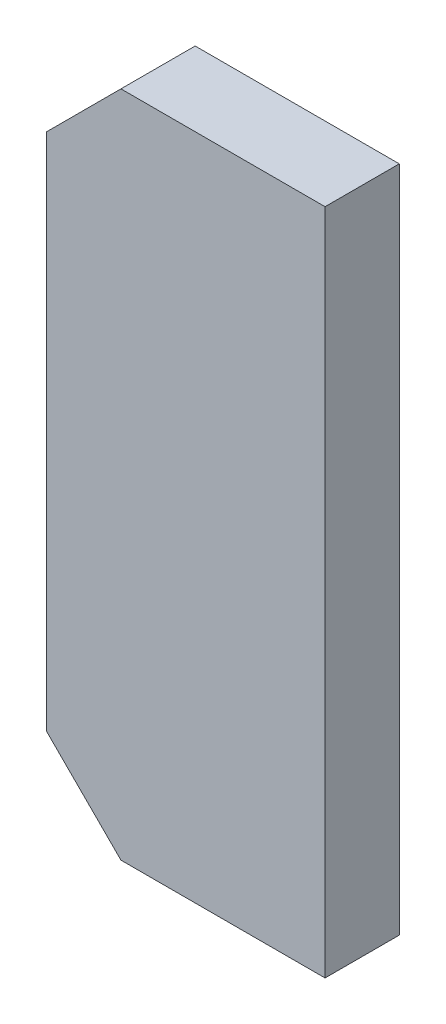
ISO-10303-21;
HEADER;
FILE_DESCRIPTION(('STEP AP214'),'2;1');
FILE_NAME('part.step','',(''),(''),'','','');
FILE_SCHEMA(('AUTOMOTIVE_DESIGN { 1 0 10303 214 1 1 1 1 }'));
ENDSEC;
DATA;
#1=APPLICATION_CONTEXT('core data for automotive mechanical design processes');
#2=APPLICATION_PROTOCOL_DEFINITION('international standard','automotive_design',2000,#1);
#3=PRODUCT_CONTEXT('',#1,'mechanical');
#4=PRODUCT('Part','Part','',(#3));
#5=PRODUCT_RELATED_PRODUCT_CATEGORY('part','',(#4));
#6=PRODUCT_DEFINITION_FORMATION('','',#4);
#7=PRODUCT_DEFINITION_CONTEXT('part definition',#1,'design');
#8=PRODUCT_DEFINITION('design','',#6,#7);
#9=PRODUCT_DEFINITION_SHAPE('','',#8);
#10=(LENGTH_UNIT() NAMED_UNIT(*) SI_UNIT(.MILLI.,.METRE.));
#11=(NAMED_UNIT(*) PLANE_ANGLE_UNIT() SI_UNIT($,.RADIAN.));
#12=(NAMED_UNIT(*) SI_UNIT($,.STERADIAN.) SOLID_ANGLE_UNIT());
#13=UNCERTAINTY_MEASURE_WITH_UNIT(LENGTH_MEASURE(1.E-05),#10,'distance_accuracy_value','');
#14=(GEOMETRIC_REPRESENTATION_CONTEXT(3) GLOBAL_UNCERTAINTY_ASSIGNED_CONTEXT((#13)) GLOBAL_UNIT_ASSIGNED_CONTEXT((#10,
#11,#12)) REPRESENTATION_CONTEXT('',''));
#15=CARTESIAN_POINT('',(0.,0.,0.));
#16=DIRECTION('',(0.,0.,1.));
#17=DIRECTION('',(1.,0.,0.));
#18=AXIS2_PLACEMENT_3D('',#15,#16,#17);
#19=CARTESIAN_POINT('',(-50.8,419.1,12.7));
#20=DIRECTION('',(1.,0.,0.));
#21=DIRECTION('',(0.,0.,-1.));
#22=AXIS2_PLACEMENT_3D('',#19,#20,#21);
#23=PLANE('',#22);
#24=DIRECTION('',(0.,-1.,0.));
#25=VECTOR('',#24,1.);
#26=CARTESIAN_POINT('',(-50.8,419.1,12.7));
#27=LINE('',#26,#25);
#28=CARTESIAN_POINT('',(-50.8,520.7,12.7));
#29=VERTEX_POINT('',#28);
#30=CARTESIAN_POINT('',(-50.8,431.8,12.7));
#31=VERTEX_POINT('',#30);
#32=EDGE_CURVE('E96',#29,#31,#27,.T.);
#33=ORIENTED_EDGE('',*,*,#32,.F.);
#34=DIRECTION('',(0.,0.,-1.));
#35=VECTOR('',#34,1.);
#36=CARTESIAN_POINT('',(-50.8,520.7,12.7));
#37=LINE('',#36,#35);
#38=CARTESIAN_POINT('',(-50.8,520.7,0.));
#39=VERTEX_POINT('',#38);
#40=EDGE_CURVE('E125',#29,#39,#37,.T.);
#41=ORIENTED_EDGE('',*,*,#40,.T.);
#42=DIRECTION('',(0.,-1.,0.));
#43=VECTOR('',#42,1.);
#44=CARTESIAN_POINT('',(-50.8,419.1,0.));
#45=LINE('',#44,#43);
#46=CARTESIAN_POINT('',(-50.8,431.8,0.));
#47=VERTEX_POINT('',#46);
#48=EDGE_CURVE('E115',#39,#47,#45,.T.);
#49=ORIENTED_EDGE('',*,*,#48,.T.);
#50=DIRECTION('',(0.,0.,1.));
#51=VECTOR('',#50,1.);
#52=CARTESIAN_POINT('',(-50.8,431.8,12.7));
#53=LINE('',#52,#51);
#54=EDGE_CURVE('E105',#47,#31,#53,.T.);
#55=ORIENTED_EDGE('',*,*,#54,.T.);
#56=EDGE_LOOP('',(#33,#41,#49,#55));
#57=FACE_BOUND('',#56,.T.);
#58=ADVANCED_FACE('F34',(#57),#23,.F.);
#59=CARTESIAN_POINT('',(-50.8,419.1,12.7));
#60=DIRECTION('',(0.,1.,0.));
#61=DIRECTION('',(0.,0.,1.));
#62=AXIS2_PLACEMENT_3D('',#59,#60,#61);
#63=PLANE('',#62);
#64=DIRECTION('',(1.,0.,0.));
#65=VECTOR('',#64,1.);
#66=CARTESIAN_POINT('',(-50.8,419.1,12.7));
#67=LINE('',#66,#65);
#68=CARTESIAN_POINT('',(-38.1,419.1,12.7));
#69=VERTEX_POINT('',#68);
#70=CARTESIAN_POINT('',(-3.175,419.1,12.7));
#71=VERTEX_POINT('',#70);
#72=EDGE_CURVE('E88',#69,#71,#67,.T.);
#73=ORIENTED_EDGE('',*,*,#72,.F.);
#74=DIRECTION('',(0.,0.,-1.));
#75=VECTOR('',#74,1.);
#76=CARTESIAN_POINT('',(-38.1,419.1,12.7));
#77=LINE('',#76,#75);
#78=CARTESIAN_POINT('',(-38.1,419.1,0.));
#79=VERTEX_POINT('',#78);
#80=EDGE_CURVE('E11',#69,#79,#77,.T.);
#81=ORIENTED_EDGE('',*,*,#80,.T.);
#82=DIRECTION('',(1.,0.,0.));
#83=VECTOR('',#82,1.);
#84=CARTESIAN_POINT('',(-50.8,419.1,0.));
#85=LINE('',#84,#83);
#86=CARTESIAN_POINT('',(-3.175,419.1,0.));
#87=VERTEX_POINT('',#86);
#88=EDGE_CURVE('E102',#79,#87,#85,.T.);
#89=ORIENTED_EDGE('',*,*,#88,.T.);
#90=DIRECTION('',(0.,0.,-1.));
#91=VECTOR('',#90,1.);
#92=CARTESIAN_POINT('',(-3.175,419.1,12.7));
#93=LINE('',#92,#91);
#94=EDGE_CURVE('E99',#71,#87,#93,.T.);
#95=ORIENTED_EDGE('',*,*,#94,.F.);
#96=EDGE_LOOP('',(#73,#81,#89,#95));
#97=FACE_BOUND('',#96,.T.);
#98=ADVANCED_FACE('F100',(#97),#63,.F.);
#99=CARTESIAN_POINT('',(-3.175,419.1,12.7));
#100=DIRECTION('',(-1.,0.,0.));
#101=DIRECTION('',(0.,-1.,0.));
#102=AXIS2_PLACEMENT_3D('',#99,#100,#101);
#103=PLANE('',#102);
#104=DIRECTION('',(0.,1.,0.));
#105=VECTOR('',#104,1.);
#106=CARTESIAN_POINT('',(-3.175,419.1,0.));
#107=LINE('',#106,#105);
#108=CARTESIAN_POINT('',(-3.175,533.4,0.));
#109=VERTEX_POINT('',#108);
#110=EDGE_CURVE('E119',#87,#109,#107,.T.);
#111=ORIENTED_EDGE('',*,*,#110,.T.);
#112=DIRECTION('',(0.,0.,-1.));
#113=VECTOR('',#112,1.);
#114=CARTESIAN_POINT('',(-3.175,533.4,12.7));
#115=LINE('',#114,#113);
#116=CARTESIAN_POINT('',(-3.175,533.4,12.7));
#117=VERTEX_POINT('',#116);
#118=EDGE_CURVE('E106',#117,#109,#115,.T.);
#119=ORIENTED_EDGE('',*,*,#118,.F.);
#120=DIRECTION('',(0.,1.,0.));
#121=VECTOR('',#120,1.);
#122=CARTESIAN_POINT('',(-3.175,419.1,12.7));
#123=LINE('',#122,#121);
#124=EDGE_CURVE('E92',#71,#117,#123,.T.);
#125=ORIENTED_EDGE('',*,*,#124,.F.);
#126=ORIENTED_EDGE('',*,*,#94,.T.);
#127=EDGE_LOOP('',(#111,#119,#125,#126));
#128=FACE_BOUND('',#127,.T.);
#129=ADVANCED_FACE('F108',(#128),#103,.F.);
#130=CARTESIAN_POINT('',(-50.8,533.4,12.7));
#131=DIRECTION('',(0.,-1.,0.));
#132=DIRECTION('',(0.,0.,-1.));
#133=AXIS2_PLACEMENT_3D('',#130,#131,#132);
#134=PLANE('',#133);
#135=DIRECTION('',(-1.,0.,0.));
#136=VECTOR('',#135,1.);
#137=CARTESIAN_POINT('',(-50.8,533.4,0.));
#138=LINE('',#137,#136);
#139=CARTESIAN_POINT('',(-38.1,533.4,0.));
#140=VERTEX_POINT('',#139);
#141=EDGE_CURVE('E121',#109,#140,#138,.T.);
#142=ORIENTED_EDGE('',*,*,#141,.T.);
#143=DIRECTION('',(0.,0.,1.));
#144=VECTOR('',#143,1.);
#145=CARTESIAN_POINT('',(-38.1,533.4,12.7));
#146=LINE('',#145,#144);
#147=CARTESIAN_POINT('',(-38.1,533.4,12.7));
#148=VERTEX_POINT('',#147);
#149=EDGE_CURVE('E58',#140,#148,#146,.T.);
#150=ORIENTED_EDGE('',*,*,#149,.T.);
#151=DIRECTION('',(-1.,0.,0.));
#152=VECTOR('',#151,1.);
#153=CARTESIAN_POINT('',(-50.8,533.4,12.7));
#154=LINE('',#153,#152);
#155=EDGE_CURVE('E110',#117,#148,#154,.T.);
#156=ORIENTED_EDGE('',*,*,#155,.F.);
#157=ORIENTED_EDGE('',*,*,#118,.T.);
#158=EDGE_LOOP('',(#142,#150,#156,#157));
#159=FACE_BOUND('',#158,.T.);
#160=ADVANCED_FACE('F144',(#159),#134,.F.);
#161=CARTESIAN_POINT('',(0.,0.,12.7));
#162=DIRECTION('',(0.,0.,-1.));
#163=DIRECTION('',(-1.,0.,0.));
#164=AXIS2_PLACEMENT_3D('',#161,#162,#163);
#165=PLANE('',#164);
#166=ORIENTED_EDGE('',*,*,#155,.T.);
#167=DIRECTION('',(0.707106781186547,0.707106781186548,0.));
#168=VECTOR('',#167,1.);
#169=CARTESIAN_POINT('',(-50.8,520.7,12.7));
#170=LINE('',#169,#168);
#171=EDGE_CURVE('E43',#148,#29,#170,.F.);
#172=ORIENTED_EDGE('',*,*,#171,.T.);
#173=ORIENTED_EDGE('',*,*,#32,.T.);
#174=DIRECTION('',(-0.707106781186546,0.707106781186549,0.));
#175=VECTOR('',#174,1.);
#176=CARTESIAN_POINT('',(-38.1,419.1,12.7));
#177=LINE('',#176,#175);
#178=EDGE_CURVE('E50',#31,#69,#177,.F.);
#179=ORIENTED_EDGE('',*,*,#178,.T.);
#180=ORIENTED_EDGE('',*,*,#72,.T.);
#181=ORIENTED_EDGE('',*,*,#124,.T.);
#182=EDGE_LOOP('',(#166,#172,#173,#179,#180,#181));
#183=FACE_BOUND('',#182,.T.);
#184=ADVANCED_FACE('F90',(#183),#165,.F.);
#185=CARTESIAN_POINT('',(0.,0.,0.));
#186=DIRECTION('',(0.,0.,-1.));
#187=DIRECTION('',(-1.,0.,0.));
#188=AXIS2_PLACEMENT_3D('',#185,#186,#187);
#189=PLANE('',#188);
#190=ORIENTED_EDGE('',*,*,#48,.F.);
#191=DIRECTION('',(-0.707106781186547,-0.707106781186548,0.));
#192=VECTOR('',#191,1.);
#193=CARTESIAN_POINT('',(-285.75,285.75,0.));
#194=LINE('',#193,#192);
#195=EDGE_CURVE('E130',#39,#140,#194,.F.);
#196=ORIENTED_EDGE('',*,*,#195,.T.);
#197=ORIENTED_EDGE('',*,*,#141,.F.);
#198=ORIENTED_EDGE('',*,*,#110,.F.);
#199=ORIENTED_EDGE('',*,*,#88,.F.);
#200=DIRECTION('',(0.707106781186546,-0.707106781186549,0.));
#201=VECTOR('',#200,1.);
#202=CARTESIAN_POINT('',(190.5,190.499999999999,0.));
#203=LINE('',#202,#201);
#204=EDGE_CURVE('E128',#79,#47,#203,.F.);
#205=ORIENTED_EDGE('',*,*,#204,.T.);
#206=EDGE_LOOP('',(#190,#196,#197,#198,#199,#205));
#207=FACE_BOUND('',#206,.T.);
#208=ADVANCED_FACE('F143',(#207),#189,.T.);
#209=CARTESIAN_POINT('',(-50.8,520.7,12.7));
#210=DIRECTION('',(0.707106781186548,-0.707106781186547,0.));
#211=DIRECTION('',(0.,0.,-1.));
#212=AXIS2_PLACEMENT_3D('',#209,#210,#211);
#213=PLANE('',#212);
#214=ORIENTED_EDGE('',*,*,#171,.F.);
#215=ORIENTED_EDGE('',*,*,#149,.F.);
#216=ORIENTED_EDGE('',*,*,#195,.F.);
#217=ORIENTED_EDGE('',*,*,#40,.F.);
#218=EDGE_LOOP('',(#214,#215,#216,#217));
#219=FACE_BOUND('',#218,.T.);
#220=ADVANCED_FACE('F140',(#219),#213,.F.);
#221=CARTESIAN_POINT('',(-38.1,419.1,12.7));
#222=DIRECTION('',(0.707106781186549,0.707106781186546,0.));
#223=DIRECTION('',(0.,0.,-1.));
#224=AXIS2_PLACEMENT_3D('',#221,#222,#223);
#225=PLANE('',#224);
#226=ORIENTED_EDGE('',*,*,#178,.F.);
#227=ORIENTED_EDGE('',*,*,#54,.F.);
#228=ORIENTED_EDGE('',*,*,#204,.F.);
#229=ORIENTED_EDGE('',*,*,#80,.F.);
#230=EDGE_LOOP('',(#226,#227,#228,#229));
#231=FACE_BOUND('',#230,.T.);
#232=ADVANCED_FACE('F37',(#231),#225,.F.);
#233=CLOSED_SHELL('',(#58,#98,#129,#160,#184,#208,#220,#232));
#234=MANIFOLD_SOLID_BREP('B2',#233);
#235=ADVANCED_BREP_SHAPE_REPRESENTATION('',(#18,#234),#14);
#236=SHAPE_DEFINITION_REPRESENTATION(#9,#235);
ENDSEC;
END-ISO-10303-21;
